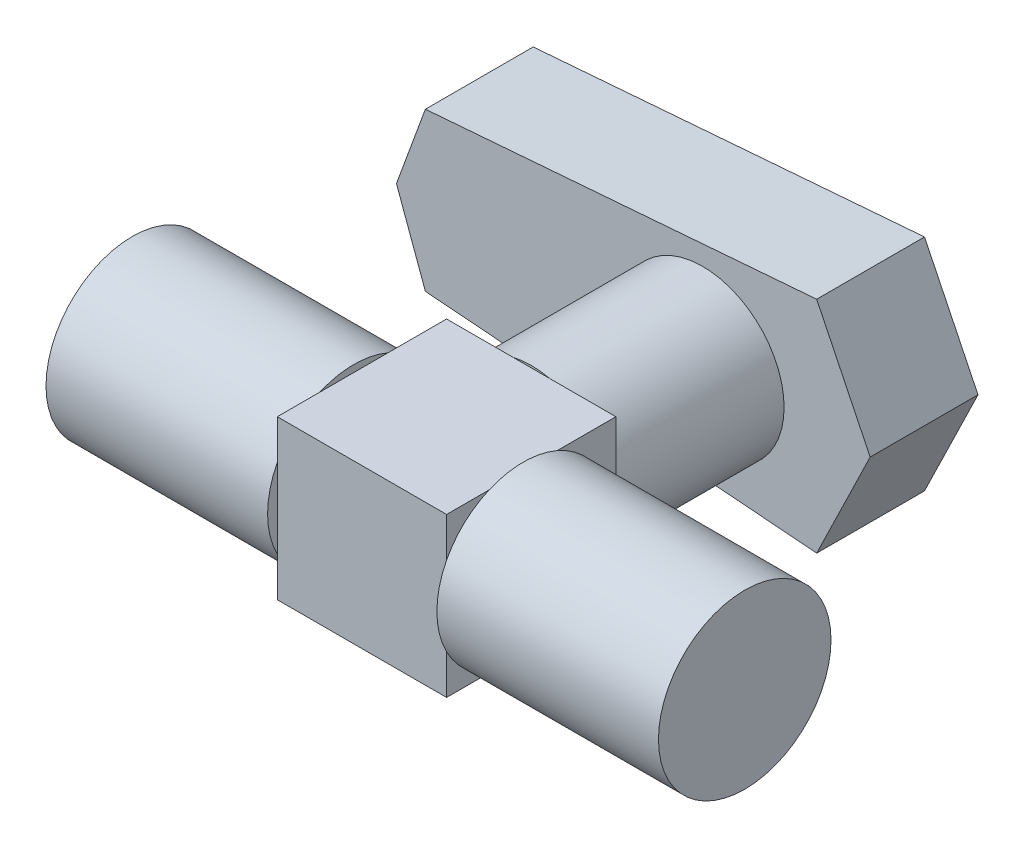
ISO-10303-21;
HEADER;
FILE_DESCRIPTION(('STEP AP214'),'2;1');
FILE_NAME('part.step','',(''),(''),'','','');
FILE_SCHEMA(('AUTOMOTIVE_DESIGN { 1 0 10303 214 1 1 1 1 }'));
ENDSEC;
DATA;
#1=APPLICATION_CONTEXT('core data for automotive mechanical design processes');
#2=APPLICATION_PROTOCOL_DEFINITION('international standard','automotive_design',2000,#1);
#3=PRODUCT_CONTEXT('',#1,'mechanical');
#4=PRODUCT('Part','Part','',(#3));
#5=PRODUCT_RELATED_PRODUCT_CATEGORY('part','',(#4));
#6=PRODUCT_DEFINITION_FORMATION('','',#4);
#7=PRODUCT_DEFINITION_CONTEXT('part definition',#1,'design');
#8=PRODUCT_DEFINITION('design','',#6,#7);
#9=PRODUCT_DEFINITION_SHAPE('','',#8);
#10=(LENGTH_UNIT() NAMED_UNIT(*) SI_UNIT(.MILLI.,.METRE.));
#11=(NAMED_UNIT(*) PLANE_ANGLE_UNIT() SI_UNIT($,.RADIAN.));
#12=(NAMED_UNIT(*) SI_UNIT($,.STERADIAN.) SOLID_ANGLE_UNIT());
#13=UNCERTAINTY_MEASURE_WITH_UNIT(LENGTH_MEASURE(1.E-05),#10,'distance_accuracy_value','');
#14=(GEOMETRIC_REPRESENTATION_CONTEXT(3) GLOBAL_UNCERTAINTY_ASSIGNED_CONTEXT((#13)) GLOBAL_UNIT_ASSIGNED_CONTEXT((#10,
#11,#12)) REPRESENTATION_CONTEXT('',''));
#15=CARTESIAN_POINT('',(0.,0.,0.));
#16=DIRECTION('',(0.,0.,1.));
#17=DIRECTION('',(1.,0.,0.));
#18=AXIS2_PLACEMENT_3D('',#15,#16,#17);
#19=CARTESIAN_POINT('',(-7.85,-7.35,-7.85));
#20=DIRECTION('',(-1.,0.,0.));
#21=DIRECTION('',(0.,0.,1.));
#22=AXIS2_PLACEMENT_3D('',#19,#20,#21);
#23=PLANE('',#22);
#24=DIRECTION('',(0.,0.,1.));
#25=VECTOR('',#24,1.);
#26=CARTESIAN_POINT('',(-7.85,7.35,-7.85));
#27=LINE('',#26,#25);
#28=CARTESIAN_POINT('',(-7.85,7.35,3.90871809441742));
#29=VERTEX_POINT('',#28);
#30=CARTESIAN_POINT('',(-7.85,7.35,7.85));
#31=VERTEX_POINT('',#30);
#32=EDGE_CURVE('E171',#29,#31,#27,.T.);
#33=ORIENTED_EDGE('',*,*,#32,.F.);
#34=CARTESIAN_POINT('',(-7.85,0.,0.750000000000002));
#35=DIRECTION('',(1.,0.,0.));
#36=DIRECTION('',(0.,0.,-1.));
#37=AXIS2_PLACEMENT_3D('',#34,#35,#36);
#38=CIRCLE('',#37,8.);
#39=CARTESIAN_POINT('',(-7.85,3.68646171823335,7.85));
#40=VERTEX_POINT('',#39);
#41=EDGE_CURVE('E11',#29,#40,#38,.T.);
#42=ORIENTED_EDGE('',*,*,#41,.T.);
#43=DIRECTION('',(0.,1.,0.));
#44=VECTOR('',#43,1.);
#45=CARTESIAN_POINT('',(-7.85,-7.35,7.85));
#46=LINE('',#45,#44);
#47=EDGE_CURVE('E172',#40,#31,#46,.T.);
#48=ORIENTED_EDGE('',*,*,#47,.T.);
#49=EDGE_LOOP('',(#33,#42,#48));
#50=FACE_BOUND('',#49,.T.);
#51=ADVANCED_FACE('F31',(#50),#23,.T.);
#52=CARTESIAN_POINT('',(-7.85,-7.35,7.85));
#53=VERTEX_POINT('',#52);
#54=CARTESIAN_POINT('',(-7.85,-3.68646171823335,7.85));
#55=VERTEX_POINT('',#54);
#56=EDGE_CURVE('E227',#53,#55,#46,.T.);
#57=ORIENTED_EDGE('',*,*,#56,.T.);
#58=CARTESIAN_POINT('',(-7.85,-7.35,3.90871809441742));
#59=VERTEX_POINT('',#58);
#60=EDGE_CURVE('E39',#55,#59,#38,.T.);
#61=ORIENTED_EDGE('',*,*,#60,.T.);
#62=DIRECTION('',(0.,0.,1.));
#63=VECTOR('',#62,1.);
#64=CARTESIAN_POINT('',(-7.85,-7.35,-7.85));
#65=LINE('',#64,#63);
#66=EDGE_CURVE('E197',#59,#53,#65,.T.);
#67=ORIENTED_EDGE('',*,*,#66,.T.);
#68=EDGE_LOOP('',(#57,#61,#67));
#69=FACE_BOUND('',#68,.T.);
#70=ADVANCED_FACE('F377',(#69),#23,.T.);
#71=CARTESIAN_POINT('',(-7.85,-7.35,-7.85));
#72=VERTEX_POINT('',#71);
#73=CARTESIAN_POINT('',(-7.85,-7.35,-2.40871809441742));
#74=VERTEX_POINT('',#73);
#75=EDGE_CURVE('E199',#72,#74,#65,.T.);
#76=ORIENTED_EDGE('',*,*,#75,.T.);
#77=CARTESIAN_POINT('',(-7.85,7.35,-2.40871809441742));
#78=VERTEX_POINT('',#77);
#79=EDGE_CURVE('E170',#74,#78,#38,.T.);
#80=ORIENTED_EDGE('',*,*,#79,.T.);
#81=CARTESIAN_POINT('',(-7.85,7.35,-7.85));
#82=VERTEX_POINT('',#81);
#83=EDGE_CURVE('E178',#82,#78,#27,.T.);
#84=ORIENTED_EDGE('',*,*,#83,.F.);
#85=DIRECTION('',(0.,1.,0.));
#86=VECTOR('',#85,1.);
#87=CARTESIAN_POINT('',(-7.85,-7.35,-7.85));
#88=LINE('',#87,#86);
#89=EDGE_CURVE('E216',#72,#82,#88,.T.);
#90=ORIENTED_EDGE('',*,*,#89,.F.);
#91=EDGE_LOOP('',(#76,#80,#84,#90));
#92=FACE_BOUND('',#91,.T.);
#93=ADVANCED_FACE('F378',(#92),#23,.T.);
#94=CARTESIAN_POINT('',(-7.85,-7.35,-7.85));
#95=DIRECTION('',(0.,0.,-1.));
#96=DIRECTION('',(-1.,0.,0.));
#97=AXIS2_PLACEMENT_3D('',#94,#95,#96);
#98=PLANE('',#97);
#99=CARTESIAN_POINT('',(0.,0.,-7.85));
#100=DIRECTION('',(0.,0.,-1.));
#101=DIRECTION('',(-1.,0.,0.));
#102=AXIS2_PLACEMENT_3D('',#99,#100,#101);
#103=CIRCLE('',#102,7.55);
#104=CARTESIAN_POINT('',(1.7262676501632,7.35,-7.85));
#105=VERTEX_POINT('',#104);
#106=CARTESIAN_POINT('',(1.7262676501632,-7.35,-7.85));
#107=VERTEX_POINT('',#106);
#108=EDGE_CURVE('E251',#105,#107,#103,.T.);
#109=ORIENTED_EDGE('',*,*,#108,.F.);
#110=DIRECTION('',(-1.,0.,0.));
#111=VECTOR('',#110,1.);
#112=CARTESIAN_POINT('',(-7.85,7.35,-7.85));
#113=LINE('',#112,#111);
#114=CARTESIAN_POINT('',(7.85,7.35,-7.85));
#115=VERTEX_POINT('',#114);
#116=EDGE_CURVE('E194',#115,#105,#113,.T.);
#117=ORIENTED_EDGE('',*,*,#116,.F.);
#118=DIRECTION('',(0.,1.,0.));
#119=VECTOR('',#118,1.);
#120=CARTESIAN_POINT('',(7.85,-7.35,-7.85));
#121=LINE('',#120,#119);
#122=CARTESIAN_POINT('',(7.85,-7.35,-7.85));
#123=VERTEX_POINT('',#122);
#124=EDGE_CURVE('E220',#123,#115,#121,.T.);
#125=ORIENTED_EDGE('',*,*,#124,.F.);
#126=DIRECTION('',(-1.,0.,0.));
#127=VECTOR('',#126,1.);
#128=CARTESIAN_POINT('',(-7.85,-7.35,-7.85));
#129=LINE('',#128,#127);
#130=EDGE_CURVE('E212',#123,#107,#129,.T.);
#131=ORIENTED_EDGE('',*,*,#130,.T.);
#132=EDGE_LOOP('',(#109,#117,#125,#131));
#133=FACE_BOUND('',#132,.T.);
#134=ADVANCED_FACE('F290',(#133),#98,.T.);
#135=CARTESIAN_POINT('',(7.85,-7.35,-7.85));
#136=DIRECTION('',(1.,0.,0.));
#137=DIRECTION('',(0.,0.,-1.));
#138=AXIS2_PLACEMENT_3D('',#135,#136,#137);
#139=PLANE('',#138);
#140=CARTESIAN_POINT('',(7.85,0.,0.750000000000002));
#141=DIRECTION('',(1.,0.,0.));
#142=DIRECTION('',(0.,0.,-1.));
#143=AXIS2_PLACEMENT_3D('',#140,#141,#142);
#144=CIRCLE('',#143,8.);
#145=CARTESIAN_POINT('',(7.85,7.35,3.90871809441742));
#146=VERTEX_POINT('',#145);
#147=CARTESIAN_POINT('',(7.85,3.68646171823335,7.85));
#148=VERTEX_POINT('',#147);
#149=EDGE_CURVE('E245',#146,#148,#144,.T.);
#150=ORIENTED_EDGE('',*,*,#149,.F.);
#151=DIRECTION('',(0.,0.,-1.));
#152=VECTOR('',#151,1.);
#153=CARTESIAN_POINT('',(7.85,7.35,-7.85));
#154=LINE('',#153,#152);
#155=CARTESIAN_POINT('',(7.85,7.35,7.85));
#156=VERTEX_POINT('',#155);
#157=EDGE_CURVE('E189',#156,#146,#154,.T.);
#158=ORIENTED_EDGE('',*,*,#157,.F.);
#159=DIRECTION('',(0.,1.,0.));
#160=VECTOR('',#159,1.);
#161=CARTESIAN_POINT('',(7.85,-7.35,7.85));
#162=LINE('',#161,#160);
#163=EDGE_CURVE('E226',#148,#156,#162,.T.);
#164=ORIENTED_EDGE('',*,*,#163,.F.);
#165=EDGE_LOOP('',(#150,#158,#164));
#166=FACE_BOUND('',#165,.T.);
#167=ADVANCED_FACE('F243',(#166),#139,.T.);
#168=CARTESIAN_POINT('',(7.85,-3.68646171823335,7.85));
#169=VERTEX_POINT('',#168);
#170=CARTESIAN_POINT('',(7.85,-7.35,3.90871809441742));
#171=VERTEX_POINT('',#170);
#172=EDGE_CURVE('E249',#169,#171,#144,.T.);
#173=ORIENTED_EDGE('',*,*,#172,.F.);
#174=CARTESIAN_POINT('',(7.85,-7.35,7.85));
#175=VERTEX_POINT('',#174);
#176=EDGE_CURVE('E223',#175,#169,#162,.T.);
#177=ORIENTED_EDGE('',*,*,#176,.F.);
#178=DIRECTION('',(0.,0.,-1.));
#179=VECTOR('',#178,1.);
#180=CARTESIAN_POINT('',(7.85,-7.35,-7.85));
#181=LINE('',#180,#179);
#182=EDGE_CURVE('E207',#175,#171,#181,.T.);
#183=ORIENTED_EDGE('',*,*,#182,.T.);
#184=EDGE_LOOP('',(#173,#177,#183));
#185=FACE_BOUND('',#184,.T.);
#186=ADVANCED_FACE('F571',(#185),#139,.T.);
#187=CARTESIAN_POINT('',(-1.7262676501632,-7.35,-7.85));
#188=VERTEX_POINT('',#187);
#189=CARTESIAN_POINT('',(-1.7262676501632,7.35,-7.85));
#190=VERTEX_POINT('',#189);
#191=EDGE_CURVE('E56',#188,#190,#103,.T.);
#192=ORIENTED_EDGE('',*,*,#191,.F.);
#193=EDGE_CURVE('E210',#188,#72,#129,.T.);
#194=ORIENTED_EDGE('',*,*,#193,.T.);
#195=ORIENTED_EDGE('',*,*,#89,.T.);
#196=EDGE_CURVE('E192',#190,#82,#113,.T.);
#197=ORIENTED_EDGE('',*,*,#196,.F.);
#198=EDGE_LOOP('',(#192,#194,#195,#197));
#199=FACE_BOUND('',#198,.T.);
#200=ADVANCED_FACE('F387',(#199),#98,.T.);
#201=CARTESIAN_POINT('',(7.85,-7.35,-2.40871809441742));
#202=VERTEX_POINT('',#201);
#203=CARTESIAN_POINT('',(7.85,7.35,-2.40871809441742));
#204=VERTEX_POINT('',#203);
#205=EDGE_CURVE('E219',#202,#204,#144,.T.);
#206=ORIENTED_EDGE('',*,*,#205,.F.);
#207=EDGE_CURVE('E206',#202,#123,#181,.T.);
#208=ORIENTED_EDGE('',*,*,#207,.T.);
#209=ORIENTED_EDGE('',*,*,#124,.T.);
#210=EDGE_CURVE('E188',#204,#115,#154,.T.);
#211=ORIENTED_EDGE('',*,*,#210,.F.);
#212=EDGE_LOOP('',(#206,#208,#209,#211));
#213=FACE_BOUND('',#212,.T.);
#214=ADVANCED_FACE('F286',(#213),#139,.T.);
#215=CARTESIAN_POINT('',(-7.85,-7.35,7.85));
#216=DIRECTION('',(0.,0.,1.));
#217=DIRECTION('',(1.,0.,0.));
#218=AXIS2_PLACEMENT_3D('',#215,#216,#217);
#219=PLANE('',#218);
#220=ORIENTED_EDGE('',*,*,#176,.T.);
#221=EDGE_CURVE('E225',#169,#148,#162,.T.);
#222=ORIENTED_EDGE('',*,*,#221,.T.);
#223=ORIENTED_EDGE('',*,*,#163,.T.);
#224=DIRECTION('',(1.,0.,0.));
#225=VECTOR('',#224,1.);
#226=CARTESIAN_POINT('',(-7.85,7.35,7.85));
#227=LINE('',#226,#225);
#228=EDGE_CURVE('E182',#31,#156,#227,.T.);
#229=ORIENTED_EDGE('',*,*,#228,.F.);
#230=ORIENTED_EDGE('',*,*,#47,.F.);
#231=EDGE_CURVE('E229',#55,#40,#46,.T.);
#232=ORIENTED_EDGE('',*,*,#231,.F.);
#233=ORIENTED_EDGE('',*,*,#56,.F.);
#234=DIRECTION('',(1.,0.,0.));
#235=VECTOR('',#234,1.);
#236=CARTESIAN_POINT('',(-7.85,-7.35,7.85));
#237=LINE('',#236,#235);
#238=EDGE_CURVE('E202',#53,#175,#237,.T.);
#239=ORIENTED_EDGE('',*,*,#238,.T.);
#240=EDGE_LOOP('',(#220,#222,#223,#229,#230,#232,#233,#239));
#241=FACE_BOUND('',#240,.T.);
#242=ADVANCED_FACE('F237',(#241),#219,.T.);
#243=CARTESIAN_POINT('',(-7.85,-7.35,7.85));
#244=DIRECTION('',(0.,1.,0.));
#245=DIRECTION('',(0.,0.,1.));
#246=AXIS2_PLACEMENT_3D('',#243,#244,#245);
#247=PLANE('',#246);
#248=ORIENTED_EDGE('',*,*,#75,.F.);
#249=ORIENTED_EDGE('',*,*,#193,.F.);
#250=EDGE_CURVE('E215',#107,#188,#129,.T.);
#251=ORIENTED_EDGE('',*,*,#250,.F.);
#252=ORIENTED_EDGE('',*,*,#130,.F.);
#253=ORIENTED_EDGE('',*,*,#207,.F.);
#254=EDGE_CURVE('E211',#171,#202,#181,.T.);
#255=ORIENTED_EDGE('',*,*,#254,.F.);
#256=ORIENTED_EDGE('',*,*,#182,.F.);
#257=ORIENTED_EDGE('',*,*,#238,.F.);
#258=ORIENTED_EDGE('',*,*,#66,.F.);
#259=EDGE_CURVE('E203',#74,#59,#65,.T.);
#260=ORIENTED_EDGE('',*,*,#259,.F.);
#261=EDGE_LOOP('',(#248,#249,#251,#252,#253,#255,#256,#257,#258,#260));
#262=FACE_BOUND('',#261,.T.);
#263=ADVANCED_FACE('F392',(#262),#247,.F.);
#264=CARTESIAN_POINT('',(-7.85,7.35,7.85));
#265=DIRECTION('',(0.,1.,0.));
#266=DIRECTION('',(0.,0.,1.));
#267=AXIS2_PLACEMENT_3D('',#264,#265,#266);
#268=PLANE('',#267);
#269=ORIENTED_EDGE('',*,*,#83,.T.);
#270=EDGE_CURVE('E166',#78,#29,#27,.T.);
#271=ORIENTED_EDGE('',*,*,#270,.T.);
#272=ORIENTED_EDGE('',*,*,#32,.T.);
#273=ORIENTED_EDGE('',*,*,#228,.T.);
#274=ORIENTED_EDGE('',*,*,#157,.T.);
#275=EDGE_CURVE('E193',#146,#204,#154,.T.);
#276=ORIENTED_EDGE('',*,*,#275,.T.);
#277=ORIENTED_EDGE('',*,*,#210,.T.);
#278=ORIENTED_EDGE('',*,*,#116,.T.);
#279=EDGE_CURVE('E198',#105,#190,#113,.T.);
#280=ORIENTED_EDGE('',*,*,#279,.T.);
#281=ORIENTED_EDGE('',*,*,#196,.T.);
#282=EDGE_LOOP('',(#269,#271,#272,#273,#274,#276,#277,#278,#280,#281));
#283=FACE_BOUND('',#282,.T.);
#284=ADVANCED_FACE('F180',(#283),#268,.T.);
#285=CARTESIAN_POINT('',(7.85,0.,0.750000000000002));
#286=DIRECTION('',(1.,0.,0.));
#287=DIRECTION('',(0.,0.,-1.));
#288=AXIS2_PLACEMENT_3D('',#285,#286,#287);
#289=PLANE('',#288);
#290=ORIENTED_EDGE('',*,*,#275,.F.);
#291=EDGE_CURVE('E185',#204,#146,#144,.T.);
#292=ORIENTED_EDGE('',*,*,#291,.F.);
#293=EDGE_LOOP('',(#290,#292));
#294=FACE_BOUND('',#293,.T.);
#295=ADVANCED_FACE('F280',(#294),#289,.F.);
#296=EDGE_CURVE('E255',#171,#202,#144,.T.);
#297=ORIENTED_EDGE('',*,*,#296,.F.);
#298=ORIENTED_EDGE('',*,*,#254,.T.);
#299=EDGE_LOOP('',(#297,#298));
#300=FACE_BOUND('',#299,.T.);
#301=ADVANCED_FACE('F276',(#300),#289,.F.);
#302=CARTESIAN_POINT('',(28.4,0.,0.749999999999999));
#303=DIRECTION('',(-1.,0.,0.));
#304=DIRECTION('',(0.,0.,1.));
#305=AXIS2_PLACEMENT_3D('',#302,#303,#304);
#306=CYLINDRICAL_SURFACE('',#305,8.);
#307=CARTESIAN_POINT('',(28.4,0.,0.749999999999999));
#308=DIRECTION('',(1.,0.,0.));
#309=DIRECTION('',(0.,0.,-1.));
#310=AXIS2_PLACEMENT_3D('',#307,#308,#309);
#311=CIRCLE('',#310,8.);
#312=CARTESIAN_POINT('',(28.4,0.,-7.25));
#313=VERTEX_POINT('',#312);
#314=EDGE_CURVE('E176',#313,#313,#311,.T.);
#315=ORIENTED_EDGE('',*,*,#314,.F.);
#316=EDGE_LOOP('',(#315));
#317=FACE_BOUND('',#316,.T.);
#318=ORIENTED_EDGE('',*,*,#291,.T.);
#319=ORIENTED_EDGE('',*,*,#149,.T.);
#320=EDGE_CURVE('E250',#148,#169,#144,.T.);
#321=ORIENTED_EDGE('',*,*,#320,.T.);
#322=ORIENTED_EDGE('',*,*,#172,.T.);
#323=ORIENTED_EDGE('',*,*,#296,.T.);
#324=ORIENTED_EDGE('',*,*,#205,.T.);
#325=EDGE_LOOP('',(#318,#319,#321,#322,#323,#324));
#326=FACE_BOUND('',#325,.T.);
#327=ADVANCED_FACE('F274',(#317,#326),#306,.T.);
#328=CARTESIAN_POINT('',(28.4,0.,0.749999999999999));
#329=DIRECTION('',(1.,0.,0.));
#330=DIRECTION('',(0.,0.,-1.));
#331=AXIS2_PLACEMENT_3D('',#328,#329,#330);
#332=PLANE('',#331);
#333=ORIENTED_EDGE('',*,*,#314,.T.);
#334=EDGE_LOOP('',(#333));
#335=FACE_BOUND('',#334,.T.);
#336=ADVANCED_FACE('F272',(#335),#332,.T.);
#337=ORIENTED_EDGE('',*,*,#221,.F.);
#338=ORIENTED_EDGE('',*,*,#320,.F.);
#339=EDGE_LOOP('',(#337,#338));
#340=FACE_BOUND('',#339,.T.);
#341=ADVANCED_FACE('F560',(#340),#289,.F.);
#342=CARTESIAN_POINT('',(0.,0.,-7.85));
#343=DIRECTION('',(0.,0.,-1.));
#344=DIRECTION('',(-1.,0.,0.));
#345=AXIS2_PLACEMENT_3D('',#342,#343,#344);
#346=PLANE('',#345);
#347=EDGE_CURVE('E261',#107,#188,#103,.T.);
#348=ORIENTED_EDGE('',*,*,#347,.F.);
#349=ORIENTED_EDGE('',*,*,#250,.T.);
#350=EDGE_LOOP('',(#348,#349));
#351=FACE_BOUND('',#350,.T.);
#352=ADVANCED_FACE('F543',(#351),#346,.F.);
#353=CARTESIAN_POINT('',(0.,0.,-33.75));
#354=DIRECTION('',(0.,0.,1.));
#355=DIRECTION('',(1.,0.,0.));
#356=AXIS2_PLACEMENT_3D('',#353,#354,#355);
#357=CYLINDRICAL_SURFACE('',#356,7.55);
#358=CARTESIAN_POINT('',(0.,0.,-23.75));
#359=DIRECTION('',(0.,0.,1.));
#360=DIRECTION('',(1.,0.,0.));
#361=AXIS2_PLACEMENT_3D('',#358,#359,#360);
#362=CIRCLE('',#361,7.55);
#363=CARTESIAN_POINT('',(7.55,0.,-23.75));
#364=VERTEX_POINT('',#363);
#365=EDGE_CURVE('E34',#364,#364,#362,.T.);
#366=ORIENTED_EDGE('',*,*,#365,.T.);
#367=EDGE_LOOP('',(#366));
#368=FACE_BOUND('',#367,.T.);
#369=EDGE_CURVE('E253',#190,#105,#103,.T.);
#370=ORIENTED_EDGE('',*,*,#369,.T.);
#371=ORIENTED_EDGE('',*,*,#108,.T.);
#372=ORIENTED_EDGE('',*,*,#347,.T.);
#373=ORIENTED_EDGE('',*,*,#191,.T.);
#374=EDGE_LOOP('',(#370,#371,#372,#373));
#375=FACE_BOUND('',#374,.T.);
#376=ADVANCED_FACE('F538',(#368,#375),#357,.T.);
#377=ORIENTED_EDGE('',*,*,#279,.F.);
#378=ORIENTED_EDGE('',*,*,#369,.F.);
#379=EDGE_LOOP('',(#377,#378));
#380=FACE_BOUND('',#379,.T.);
#381=ADVANCED_FACE('F531',(#380),#346,.F.);
#382=CARTESIAN_POINT('',(10.5721072127905,10.1985449394511,-23.75));
#383=DIRECTION('',(0.,0.,1.));
#384=DIRECTION('',(1.,0.,0.));
#385=AXIS2_PLACEMENT_3D('',#382,#383,#384);
#386=PLANE('',#385);
#387=DIRECTION('',(0.437368180066445,-0.899282533503996,0.));
#388=VECTOR('',#387,1.);
#389=CARTESIAN_POINT('',(15.5321935853274,-1.0846072810894E-13,-23.75));
#390=LINE('',#389,#388);
#391=CARTESIAN_POINT('',(10.5721072127905,10.1985449394511,-23.75));
#392=VERTEX_POINT('',#391);
#393=CARTESIAN_POINT('',(15.5321935853274,-1.0846072810894E-13,-23.75));
#394=VERTEX_POINT('',#393);
#395=EDGE_CURVE('E295',#392,#394,#390,.T.);
#396=ORIENTED_EDGE('',*,*,#395,.F.);
#397=DIRECTION('',(0.996854940874737,0.079247882328961,0.));
#398=VECTOR('',#397,1.);
#399=CARTESIAN_POINT('',(10.5721072127905,10.1985449394511,-23.75));
#400=LINE('',#399,#398);
#401=CARTESIAN_POINT('',(-25.7175043087301,7.31359674317932,-23.75));
#402=VERTEX_POINT('',#401);
#403=EDGE_CURVE('E311',#402,#392,#400,.T.);
#404=ORIENTED_EDGE('',*,*,#403,.F.);
#405=DIRECTION('',(0.344350100440591,0.938841311578562,0.));
#406=VECTOR('',#405,1.);
#407=CARTESIAN_POINT('',(-25.7175043087301,7.31359674317932,-23.75));
#408=LINE('',#407,#406);
#409=CARTESIAN_POINT('',(-28.4,1.9831614004629E-13,-23.75));
#410=VERTEX_POINT('',#409);
#411=EDGE_CURVE('E308',#410,#402,#408,.T.);
#412=ORIENTED_EDGE('',*,*,#411,.F.);
#413=DIRECTION('',(-0.344350100440568,0.93884131157857,0.));
#414=VECTOR('',#413,1.);
#415=CARTESIAN_POINT('',(-25.7175043087301,-7.31359674317948,-23.75));
#416=LINE('',#415,#414);
#417=CARTESIAN_POINT('',(-25.7175043087301,-7.31359674317948,-23.75));
#418=VERTEX_POINT('',#417);
#419=EDGE_CURVE('E305',#418,#410,#416,.T.);
#420=ORIENTED_EDGE('',*,*,#419,.F.);
#421=DIRECTION('',(-0.996854940874737,0.0792478823289611,0.));
#422=VECTOR('',#421,1.);
#423=CARTESIAN_POINT('',(10.5721072127904,-10.1985449394512,-23.75));
#424=LINE('',#423,#422);
#425=CARTESIAN_POINT('',(10.5721072127904,-10.1985449394512,-23.75));
#426=VERTEX_POINT('',#425);
#427=EDGE_CURVE('E302',#426,#418,#424,.T.);
#428=ORIENTED_EDGE('',*,*,#427,.F.);
#429=DIRECTION('',(-0.437368180066458,-0.89928253350399,0.));
#430=VECTOR('',#429,1.);
#431=CARTESIAN_POINT('',(15.5321935853274,-1.0846072810894E-13,-23.75));
#432=LINE('',#431,#430);
#433=EDGE_CURVE('E298',#394,#426,#432,.T.);
#434=ORIENTED_EDGE('',*,*,#433,.F.);
#435=EDGE_LOOP('',(#396,#404,#412,#420,#428,#434));
#436=FACE_BOUND('',#435,.T.);
#437=ORIENTED_EDGE('',*,*,#365,.F.);
#438=EDGE_LOOP('',(#437));
#439=FACE_BOUND('',#438,.T.);
#440=ADVANCED_FACE('F356',(#436,#439),#386,.T.);
#441=CARTESIAN_POINT('',(15.5321935853274,-1.0846072810894E-13,-23.75));
#442=DIRECTION('',(0.899282533503996,0.437368180066445,0.));
#443=DIRECTION('',(-0.437368180066445,0.899282533503996,0.));
#444=AXIS2_PLACEMENT_3D('',#441,#442,#443);
#445=PLANE('',#444);
#446=DIRECTION('',(0.437368180066445,-0.899282533503996,0.));
#447=VECTOR('',#446,1.);
#448=CARTESIAN_POINT('',(15.5321935853274,-1.0846072810894E-13,-33.75));
#449=LINE('',#448,#447);
#450=CARTESIAN_POINT('',(10.5721072127905,10.1985449394511,-33.75));
#451=VERTEX_POINT('',#450);
#452=CARTESIAN_POINT('',(15.5321935853274,-1.0846072810894E-13,-33.75));
#453=VERTEX_POINT('',#452);
#454=EDGE_CURVE('E314',#451,#453,#449,.T.);
#455=ORIENTED_EDGE('',*,*,#454,.F.);
#456=DIRECTION('',(0.,0.,-1.));
#457=VECTOR('',#456,1.);
#458=CARTESIAN_POINT('',(10.5721072127905,10.1985449394511,-23.75));
#459=LINE('',#458,#457);
#460=EDGE_CURVE('E331',#392,#451,#459,.T.);
#461=ORIENTED_EDGE('',*,*,#460,.F.);
#462=ORIENTED_EDGE('',*,*,#395,.T.);
#463=DIRECTION('',(0.,0.,-1.));
#464=VECTOR('',#463,1.);
#465=CARTESIAN_POINT('',(15.5321935853274,-1.0846072810894E-13,-23.75));
#466=LINE('',#465,#464);
#467=EDGE_CURVE('E267',#394,#453,#466,.T.);
#468=ORIENTED_EDGE('',*,*,#467,.T.);
#469=EDGE_LOOP('',(#455,#461,#462,#468));
#470=FACE_BOUND('',#469,.T.);
#471=ADVANCED_FACE('F344',(#470),#445,.T.);
#472=CARTESIAN_POINT('',(10.5721072127905,10.1985449394511,-23.75));
#473=DIRECTION('',(-0.079247882328961,0.996854940874737,0.));
#474=DIRECTION('',(-0.996854940874737,-0.079247882328961,0.));
#475=AXIS2_PLACEMENT_3D('',#472,#473,#474);
#476=PLANE('',#475);
#477=DIRECTION('',(0.996854940874737,0.079247882328961,0.));
#478=VECTOR('',#477,1.);
#479=CARTESIAN_POINT('',(10.5721072127905,10.1985449394511,-33.75));
#480=LINE('',#479,#478);
#481=CARTESIAN_POINT('',(-25.7175043087301,7.31359674317932,-33.75));
#482=VERTEX_POINT('',#481);
#483=EDGE_CURVE('E299',#482,#451,#480,.T.);
#484=ORIENTED_EDGE('',*,*,#483,.F.);
#485=DIRECTION('',(0.,0.,-1.));
#486=VECTOR('',#485,1.);
#487=CARTESIAN_POINT('',(-25.7175043087301,7.31359674317932,-23.75));
#488=LINE('',#487,#486);
#489=EDGE_CURVE('E333',#402,#482,#488,.T.);
#490=ORIENTED_EDGE('',*,*,#489,.F.);
#491=ORIENTED_EDGE('',*,*,#403,.T.);
#492=ORIENTED_EDGE('',*,*,#460,.T.);
#493=EDGE_LOOP('',(#484,#490,#491,#492));
#494=FACE_BOUND('',#493,.T.);
#495=ADVANCED_FACE('F353',(#494),#476,.T.);
#496=CARTESIAN_POINT('',(-25.7175043087301,7.31359674317932,-23.75));
#497=DIRECTION('',(-0.938841311578562,0.344350100440591,0.));
#498=DIRECTION('',(-0.344350100440591,-0.938841311578562,0.));
#499=AXIS2_PLACEMENT_3D('',#496,#497,#498);
#500=PLANE('',#499);
#501=DIRECTION('',(0.344350100440591,0.938841311578562,0.));
#502=VECTOR('',#501,1.);
#503=CARTESIAN_POINT('',(-25.7175043087301,7.31359674317932,-33.75));
#504=LINE('',#503,#502);
#505=CARTESIAN_POINT('',(-28.4,1.9831614004629E-13,-33.75));
#506=VERTEX_POINT('',#505);
#507=EDGE_CURVE('E326',#506,#482,#504,.T.);
#508=ORIENTED_EDGE('',*,*,#507,.F.);
#509=DIRECTION('',(0.,0.,-1.));
#510=VECTOR('',#509,1.);
#511=CARTESIAN_POINT('',(-28.4,1.9831614004629E-13,-23.75));
#512=LINE('',#511,#510);
#513=EDGE_CURVE('E335',#410,#506,#512,.T.);
#514=ORIENTED_EDGE('',*,*,#513,.F.);
#515=ORIENTED_EDGE('',*,*,#411,.T.);
#516=ORIENTED_EDGE('',*,*,#489,.T.);
#517=EDGE_LOOP('',(#508,#514,#515,#516));
#518=FACE_BOUND('',#517,.T.);
#519=ADVANCED_FACE('F367',(#518),#500,.T.);
#520=CARTESIAN_POINT('',(-25.7175043087301,-7.31359674317948,-23.75));
#521=DIRECTION('',(-0.938841311578571,-0.344350100440568,0.));
#522=DIRECTION('',(0.344350100440568,-0.938841311578571,0.));
#523=AXIS2_PLACEMENT_3D('',#520,#521,#522);
#524=PLANE('',#523);
#525=DIRECTION('',(-0.344350100440568,0.93884131157857,0.));
#526=VECTOR('',#525,1.);
#527=CARTESIAN_POINT('',(-25.7175043087301,-7.31359674317948,-33.75));
#528=LINE('',#527,#526);
#529=CARTESIAN_POINT('',(-25.7175043087301,-7.31359674317948,-33.75));
#530=VERTEX_POINT('',#529);
#531=EDGE_CURVE('E323',#530,#506,#528,.T.);
#532=ORIENTED_EDGE('',*,*,#531,.F.);
#533=DIRECTION('',(0.,0.,-1.));
#534=VECTOR('',#533,1.);
#535=CARTESIAN_POINT('',(-25.7175043087301,-7.31359674317948,-23.75));
#536=LINE('',#535,#534);
#537=EDGE_CURVE('E337',#418,#530,#536,.T.);
#538=ORIENTED_EDGE('',*,*,#537,.F.);
#539=ORIENTED_EDGE('',*,*,#419,.T.);
#540=ORIENTED_EDGE('',*,*,#513,.T.);
#541=EDGE_LOOP('',(#532,#538,#539,#540));
#542=FACE_BOUND('',#541,.T.);
#543=ADVANCED_FACE('F365',(#542),#524,.T.);
#544=CARTESIAN_POINT('',(10.5721072127904,-10.1985449394512,-23.75));
#545=DIRECTION('',(-0.0792478823289611,-0.996854940874737,0.));
#546=DIRECTION('',(0.996854940874737,-0.0792478823289611,0.));
#547=AXIS2_PLACEMENT_3D('',#544,#545,#546);
#548=PLANE('',#547);
#549=DIRECTION('',(-0.996854940874737,0.0792478823289611,0.));
#550=VECTOR('',#549,1.);
#551=CARTESIAN_POINT('',(10.5721072127904,-10.1985449394512,-33.75));
#552=LINE('',#551,#550);
#553=CARTESIAN_POINT('',(10.5721072127904,-10.1985449394512,-33.75));
#554=VERTEX_POINT('',#553);
#555=EDGE_CURVE('E320',#554,#530,#552,.T.);
#556=ORIENTED_EDGE('',*,*,#555,.F.);
#557=DIRECTION('',(0.,0.,-1.));
#558=VECTOR('',#557,1.);
#559=CARTESIAN_POINT('',(10.5721072127904,-10.1985449394512,-23.75));
#560=LINE('',#559,#558);
#561=EDGE_CURVE('E338',#426,#554,#560,.T.);
#562=ORIENTED_EDGE('',*,*,#561,.F.);
#563=ORIENTED_EDGE('',*,*,#427,.T.);
#564=ORIENTED_EDGE('',*,*,#537,.T.);
#565=EDGE_LOOP('',(#556,#562,#563,#564));
#566=FACE_BOUND('',#565,.T.);
#567=ADVANCED_FACE('F362',(#566),#548,.T.);
#568=CARTESIAN_POINT('',(15.5321935853274,-1.0846072810894E-13,-23.75));
#569=DIRECTION('',(0.89928253350399,-0.437368180066458,0.));
#570=DIRECTION('',(0.437368180066458,0.89928253350399,0.));
#571=AXIS2_PLACEMENT_3D('',#568,#569,#570);
#572=PLANE('',#571);
#573=DIRECTION('',(-0.437368180066458,-0.89928253350399,0.));
#574=VECTOR('',#573,1.);
#575=CARTESIAN_POINT('',(15.5321935853274,-1.0846072810894E-13,-33.75));
#576=LINE('',#575,#574);
#577=EDGE_CURVE('E317',#453,#554,#576,.T.);
#578=ORIENTED_EDGE('',*,*,#577,.F.);
#579=ORIENTED_EDGE('',*,*,#467,.F.);
#580=ORIENTED_EDGE('',*,*,#433,.T.);
#581=ORIENTED_EDGE('',*,*,#561,.T.);
#582=EDGE_LOOP('',(#578,#579,#580,#581));
#583=FACE_BOUND('',#582,.T.);
#584=ADVANCED_FACE('F347',(#583),#572,.T.);
#585=CARTESIAN_POINT('',(0.,0.,-33.75));
#586=DIRECTION('',(0.,0.,-1.));
#587=DIRECTION('',(-1.,0.,0.));
#588=AXIS2_PLACEMENT_3D('',#585,#586,#587);
#589=PLANE('',#588);
#590=ORIENTED_EDGE('',*,*,#454,.T.);
#591=ORIENTED_EDGE('',*,*,#577,.T.);
#592=ORIENTED_EDGE('',*,*,#555,.T.);
#593=ORIENTED_EDGE('',*,*,#531,.T.);
#594=ORIENTED_EDGE('',*,*,#507,.T.);
#595=ORIENTED_EDGE('',*,*,#483,.T.);
#596=EDGE_LOOP('',(#590,#591,#592,#593,#594,#595));
#597=FACE_BOUND('',#596,.T.);
#598=ADVANCED_FACE('F349',(#597),#589,.T.);
#599=CARTESIAN_POINT('',(-7.85,0.,0.750000000000002));
#600=DIRECTION('',(-1.,0.,0.));
#601=DIRECTION('',(0.,0.,-1.));
#602=AXIS2_PLACEMENT_3D('',#599,#600,#601);
#603=PLANE('',#602);
#604=EDGE_CURVE('E41',#40,#55,#38,.T.);
#605=ORIENTED_EDGE('',*,*,#604,.T.);
#606=ORIENTED_EDGE('',*,*,#231,.T.);
#607=EDGE_LOOP('',(#605,#606));
#608=FACE_BOUND('',#607,.T.);
#609=ADVANCED_FACE('F235',(#608),#603,.F.);
#610=EDGE_CURVE('E169',#59,#74,#38,.T.);
#611=ORIENTED_EDGE('',*,*,#610,.T.);
#612=ORIENTED_EDGE('',*,*,#259,.T.);
#613=EDGE_LOOP('',(#611,#612));
#614=FACE_BOUND('',#613,.T.);
#615=ADVANCED_FACE('F398',(#614),#603,.F.);
#616=CARTESIAN_POINT('',(-28.4,0.,0.749999999999999));
#617=DIRECTION('',(1.,0.,0.));
#618=DIRECTION('',(0.,0.,-1.));
#619=AXIS2_PLACEMENT_3D('',#616,#617,#618);
#620=CYLINDRICAL_SURFACE('',#619,8.);
#621=CARTESIAN_POINT('',(-28.4,0.,0.749999999999999));
#622=DIRECTION('',(1.,0.,0.));
#623=DIRECTION('',(0.,0.,-1.));
#624=AXIS2_PLACEMENT_3D('',#621,#622,#623);
#625=CIRCLE('',#624,8.);
#626=CARTESIAN_POINT('',(-28.4,0.,-7.25));
#627=VERTEX_POINT('',#626);
#628=EDGE_CURVE('E168',#627,#627,#625,.T.);
#629=ORIENTED_EDGE('',*,*,#628,.T.);
#630=EDGE_LOOP('',(#629));
#631=FACE_BOUND('',#630,.T.);
#632=EDGE_CURVE('E48',#78,#29,#38,.T.);
#633=ORIENTED_EDGE('',*,*,#632,.F.);
#634=ORIENTED_EDGE('',*,*,#79,.F.);
#635=ORIENTED_EDGE('',*,*,#610,.F.);
#636=ORIENTED_EDGE('',*,*,#60,.F.);
#637=ORIENTED_EDGE('',*,*,#604,.F.);
#638=ORIENTED_EDGE('',*,*,#41,.F.);
#639=EDGE_LOOP('',(#633,#634,#635,#636,#637,#638));
#640=FACE_BOUND('',#639,.T.);
#641=ADVANCED_FACE('F157',(#631,#640),#620,.T.);
#642=CARTESIAN_POINT('',(-28.4,0.,0.749999999999999));
#643=DIRECTION('',(-1.,0.,0.));
#644=DIRECTION('',(0.,0.,-1.));
#645=AXIS2_PLACEMENT_3D('',#642,#643,#644);
#646=PLANE('',#645);
#647=ORIENTED_EDGE('',*,*,#628,.F.);
#648=EDGE_LOOP('',(#647));
#649=FACE_BOUND('',#648,.T.);
#650=ADVANCED_FACE('F405',(#649),#646,.T.);
#651=ORIENTED_EDGE('',*,*,#270,.F.);
#652=ORIENTED_EDGE('',*,*,#632,.T.);
#653=EDGE_LOOP('',(#651,#652));
#654=FACE_BOUND('',#653,.T.);
#655=ADVANCED_FACE('F164',(#654),#603,.F.);
#656=CLOSED_SHELL('',(#51,#70,#93,#134,#167,#186,#200,#214,#242,#263,#284,#295,#301,#327,#336,
#341,#352,#376,#381,#440,#471,#495,#519,#543,#567,#584,#598,#609,#615,#641,#650,#655));
#657=MANIFOLD_SOLID_BREP('B2',#656);
#658=ADVANCED_BREP_SHAPE_REPRESENTATION('',(#18,#657),#14);
#659=SHAPE_DEFINITION_REPRESENTATION(#9,#658);
ENDSEC;
END-ISO-10303-21;
